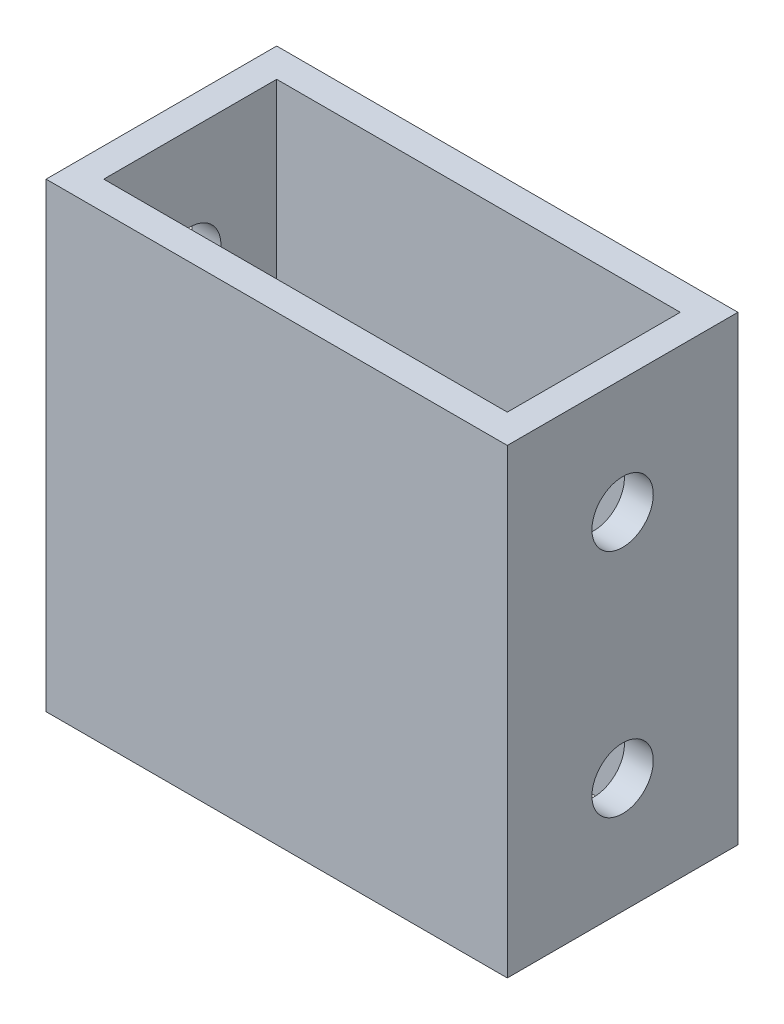
ISO-10303-21;
HEADER;
FILE_DESCRIPTION(('STEP AP214'),'2;1');
FILE_NAME('part.step','',(''),(''),'','','');
FILE_SCHEMA(('AUTOMOTIVE_DESIGN { 1 0 10303 214 1 1 1 1 }'));
ENDSEC;
DATA;
#1=APPLICATION_CONTEXT('core data for automotive mechanical design processes');
#2=APPLICATION_PROTOCOL_DEFINITION('international standard','automotive_design',2000,#1);
#3=PRODUCT_CONTEXT('',#1,'mechanical');
#4=PRODUCT('Part','Part','',(#3));
#5=PRODUCT_RELATED_PRODUCT_CATEGORY('part','',(#4));
#6=PRODUCT_DEFINITION_FORMATION('','',#4);
#7=PRODUCT_DEFINITION_CONTEXT('part definition',#1,'design');
#8=PRODUCT_DEFINITION('design','',#6,#7);
#9=PRODUCT_DEFINITION_SHAPE('','',#8);
#10=(LENGTH_UNIT() NAMED_UNIT(*) SI_UNIT(.MILLI.,.METRE.));
#11=(NAMED_UNIT(*) PLANE_ANGLE_UNIT() SI_UNIT($,.RADIAN.));
#12=(NAMED_UNIT(*) SI_UNIT($,.STERADIAN.) SOLID_ANGLE_UNIT());
#13=UNCERTAINTY_MEASURE_WITH_UNIT(LENGTH_MEASURE(1.E-05),#10,'distance_accuracy_value','');
#14=(GEOMETRIC_REPRESENTATION_CONTEXT(3) GLOBAL_UNCERTAINTY_ASSIGNED_CONTEXT((#13)) GLOBAL_UNIT_ASSIGNED_CONTEXT((#10,
#11,#12)) REPRESENTATION_CONTEXT('',''));
#15=CARTESIAN_POINT('',(0.,0.,0.));
#16=DIRECTION('',(0.,0.,1.));
#17=DIRECTION('',(1.,0.,0.));
#18=AXIS2_PLACEMENT_3D('',#15,#16,#17);
#19=CARTESIAN_POINT('',(-115.170418990036,12.7000000000002,-7.51361465816793));
#20=DIRECTION('',(1.,0.,0.));
#21=DIRECTION('',(0.,1.,0.));
#22=AXIS2_PLACEMENT_3D('',#19,#20,#21);
#23=CYLINDRICAL_SURFACE('',#22,3.3782);
#24=CARTESIAN_POINT('',(-42.1454189900364,12.7000000000002,-7.51361465816793));
#25=DIRECTION('',(1.,0.,0.));
#26=DIRECTION('',(0.,1.,0.));
#27=AXIS2_PLACEMENT_3D('',#24,#25,#26);
#28=CIRCLE('',#27,3.3782);
#29=CARTESIAN_POINT('',(-42.1454189900364,16.0782000000002,-7.51361465816793));
#30=VERTEX_POINT('',#29);
#31=EDGE_CURVE('E159',#30,#30,#28,.T.);
#32=ORIENTED_EDGE('',*,*,#31,.F.);
#33=EDGE_LOOP('',(#32));
#34=FACE_BOUND('',#33,.T.);
#35=CARTESIAN_POINT('',(-38.9704189900364,12.7000000000002,-7.51361465816793));
#36=DIRECTION('',(-1.,0.,0.));
#37=DIRECTION('',(0.,0.,1.));
#38=AXIS2_PLACEMENT_3D('',#35,#36,#37);
#39=CIRCLE('',#38,3.3782);
#40=CARTESIAN_POINT('',(-38.9704189900364,12.7000000000002,-4.13541465816793));
#41=VERTEX_POINT('',#40);
#42=EDGE_CURVE('E11',#41,#41,#39,.T.);
#43=ORIENTED_EDGE('',*,*,#42,.F.);
#44=EDGE_LOOP('',(#43));
#45=FACE_BOUND('',#44,.T.);
#46=ADVANCED_FACE('F16',(#34,#45),#23,.F.);
#47=CARTESIAN_POINT('',(-115.170418990036,38.1000000000002,-7.51361465816793));
#48=DIRECTION('',(1.,0.,0.));
#49=DIRECTION('',(0.,1.,0.));
#50=AXIS2_PLACEMENT_3D('',#47,#48,#49);
#51=CYLINDRICAL_SURFACE('',#50,3.3782);
#52=CARTESIAN_POINT('',(-42.1454189900364,38.1000000000002,-7.51361465816793));
#53=DIRECTION('',(1.,0.,0.));
#54=DIRECTION('',(0.,1.,0.));
#55=AXIS2_PLACEMENT_3D('',#52,#53,#54);
#56=CIRCLE('',#55,3.3782);
#57=CARTESIAN_POINT('',(-42.1454189900364,41.4782000000002,-7.51361465816793));
#58=VERTEX_POINT('',#57);
#59=EDGE_CURVE('E123',#58,#58,#56,.T.);
#60=ORIENTED_EDGE('',*,*,#59,.F.);
#61=EDGE_LOOP('',(#60));
#62=FACE_BOUND('',#61,.T.);
#63=CARTESIAN_POINT('',(-38.9704189900364,38.1000000000002,-7.51361465816793));
#64=DIRECTION('',(-1.,0.,0.));
#65=DIRECTION('',(0.,0.,1.));
#66=AXIS2_PLACEMENT_3D('',#63,#64,#65);
#67=CIRCLE('',#66,3.3782);
#68=CARTESIAN_POINT('',(-38.9704189900364,38.1000000000002,-4.13541465816793));
#69=VERTEX_POINT('',#68);
#70=EDGE_CURVE('E26',#69,#69,#67,.T.);
#71=ORIENTED_EDGE('',*,*,#70,.F.);
#72=EDGE_LOOP('',(#71));
#73=FACE_BOUND('',#72,.T.);
#74=ADVANCED_FACE('F198',(#62,#73),#51,.F.);
#75=CARTESIAN_POINT('',(-67.5454189900364,12.7000000000001,-7.51361465816796));
#76=DIRECTION('',(1.,0.,0.));
#77=DIRECTION('',(0.,1.,0.));
#78=AXIS2_PLACEMENT_3D('',#75,#76,#77);
#79=CYLINDRICAL_SURFACE('',#78,3.3782);
#80=CARTESIAN_POINT('',(5.4795810099636,12.7000000000001,-7.51361465816796));
#81=DIRECTION('',(1.,0.,0.));
#82=DIRECTION('',(0.,1.,0.));
#83=AXIS2_PLACEMENT_3D('',#80,#81,#82);
#84=CIRCLE('',#83,3.3782);
#85=CARTESIAN_POINT('',(5.4795810099636,16.0782000000001,-7.51361465816796));
#86=VERTEX_POINT('',#85);
#87=EDGE_CURVE('E148',#86,#86,#84,.T.);
#88=ORIENTED_EDGE('',*,*,#87,.F.);
#89=EDGE_LOOP('',(#88));
#90=FACE_BOUND('',#89,.T.);
#91=CARTESIAN_POINT('',(8.65458100996359,12.7000000000001,-7.51361465816796));
#92=DIRECTION('',(-1.,0.,0.));
#93=DIRECTION('',(0.,0.,1.));
#94=AXIS2_PLACEMENT_3D('',#91,#92,#93);
#95=CIRCLE('',#94,3.3782);
#96=CARTESIAN_POINT('',(8.65458100996359,12.7000000000001,-4.13541465816796));
#97=VERTEX_POINT('',#96);
#98=EDGE_CURVE('E128',#97,#97,#95,.T.);
#99=ORIENTED_EDGE('',*,*,#98,.F.);
#100=EDGE_LOOP('',(#99));
#101=FACE_BOUND('',#100,.T.);
#102=ADVANCED_FACE('F204',(#90,#101),#79,.F.);
#103=CARTESIAN_POINT('',(-67.5454189900364,38.1,-7.51361465816796));
#104=DIRECTION('',(1.,0.,0.));
#105=DIRECTION('',(0.,1.,0.));
#106=AXIS2_PLACEMENT_3D('',#103,#104,#105);
#107=CYLINDRICAL_SURFACE('',#106,3.3782);
#108=CARTESIAN_POINT('',(5.4795810099636,38.1,-7.51361465816796));
#109=DIRECTION('',(1.,0.,0.));
#110=DIRECTION('',(0.,1.,0.));
#111=AXIS2_PLACEMENT_3D('',#108,#109,#110);
#112=CIRCLE('',#111,3.3782);
#113=CARTESIAN_POINT('',(5.4795810099636,41.4782,-7.51361465816796));
#114=VERTEX_POINT('',#113);
#115=EDGE_CURVE('E152',#114,#114,#112,.T.);
#116=ORIENTED_EDGE('',*,*,#115,.F.);
#117=EDGE_LOOP('',(#116));
#118=FACE_BOUND('',#117,.T.);
#119=CARTESIAN_POINT('',(8.65458100996359,38.1,-7.51361465816796));
#120=DIRECTION('',(-1.,0.,0.));
#121=DIRECTION('',(0.,0.,1.));
#122=AXIS2_PLACEMENT_3D('',#119,#120,#121);
#123=CIRCLE('',#122,3.3782);
#124=CARTESIAN_POINT('',(8.65458100996359,38.1,-4.13541465816796));
#125=VERTEX_POINT('',#124);
#126=EDGE_CURVE('E132',#125,#125,#123,.T.);
#127=ORIENTED_EDGE('',*,*,#126,.F.);
#128=EDGE_LOOP('',(#127));
#129=FACE_BOUND('',#128,.T.);
#130=ADVANCED_FACE('F211',(#118,#129),#107,.F.);
#131=CARTESIAN_POINT('',(-38.9704189900364,0.,-17.038614658168));
#132=DIRECTION('',(-1.,0.,0.));
#133=DIRECTION('',(0.,0.,1.));
#134=AXIS2_PLACEMENT_3D('',#131,#132,#133);
#135=PLANE('',#134);
#136=ORIENTED_EDGE('',*,*,#42,.T.);
#137=EDGE_LOOP('',(#136));
#138=FACE_BOUND('',#137,.T.);
#139=ORIENTED_EDGE('',*,*,#70,.T.);
#140=EDGE_LOOP('',(#139));
#141=FACE_BOUND('',#140,.T.);
#142=DIRECTION('',(0.,0.,1.));
#143=VECTOR('',#142,1.);
#144=CARTESIAN_POINT('',(-38.9704189900364,0.,-12.276114658168));
#145=LINE('',#144,#143);
#146=CARTESIAN_POINT('',(-38.9704189900364,0.,-17.038614658168));
#147=VERTEX_POINT('',#146);
#148=CARTESIAN_POINT('',(-38.9704189900364,0.,2.01138534183206));
#149=VERTEX_POINT('',#148);
#150=EDGE_CURVE('E35',#147,#149,#145,.T.);
#151=ORIENTED_EDGE('',*,*,#150,.F.);
#152=DIRECTION('',(0.,1.,0.));
#153=VECTOR('',#152,1.);
#154=CARTESIAN_POINT('',(-38.9704189900364,0.,-17.038614658168));
#155=LINE('',#154,#153);
#156=CARTESIAN_POINT('',(-38.9704189900364,50.8,-17.038614658168));
#157=VERTEX_POINT('',#156);
#158=EDGE_CURVE('E147',#147,#157,#155,.T.);
#159=ORIENTED_EDGE('',*,*,#158,.T.);
#160=DIRECTION('',(0.,0.,-1.));
#161=VECTOR('',#160,1.);
#162=CARTESIAN_POINT('',(-38.9704189900364,50.8,-12.276114658168));
#163=LINE('',#162,#161);
#164=CARTESIAN_POINT('',(-38.9704189900364,50.8,2.01138534183206));
#165=VERTEX_POINT('',#164);
#166=EDGE_CURVE('E102',#165,#157,#163,.T.);
#167=ORIENTED_EDGE('',*,*,#166,.F.);
#168=DIRECTION('',(0.,1.,0.));
#169=VECTOR('',#168,1.);
#170=CARTESIAN_POINT('',(-38.9704189900364,0.,2.01138534183206));
#171=LINE('',#170,#169);
#172=EDGE_CURVE('E142',#149,#165,#171,.T.);
#173=ORIENTED_EDGE('',*,*,#172,.F.);
#174=EDGE_LOOP('',(#151,#159,#167,#173));
#175=FACE_BOUND('',#174,.T.);
#176=ADVANCED_FACE('F179',(#138,#141,#175),#135,.F.);
#177=CARTESIAN_POINT('',(5.47958100996359,0.,-17.038614658168));
#178=DIRECTION('',(0.,0.,-1.));
#179=DIRECTION('',(-1.,0.,0.));
#180=AXIS2_PLACEMENT_3D('',#177,#178,#179);
#181=PLANE('',#180);
#182=DIRECTION('',(-1.,0.,0.));
#183=VECTOR('',#182,1.);
#184=CARTESIAN_POINT('',(-5.63291899003641,0.,-17.038614658168));
#185=LINE('',#184,#183);
#186=CARTESIAN_POINT('',(5.47958100996359,0.,-17.038614658168));
#187=VERTEX_POINT('',#186);
#188=EDGE_CURVE('E133',#187,#147,#185,.T.);
#189=ORIENTED_EDGE('',*,*,#188,.F.);
#190=DIRECTION('',(0.,1.,0.));
#191=VECTOR('',#190,1.);
#192=CARTESIAN_POINT('',(5.47958100996359,0.,-17.038614658168));
#193=LINE('',#192,#191);
#194=CARTESIAN_POINT('',(5.47958100996359,50.8,-17.038614658168));
#195=VERTEX_POINT('',#194);
#196=EDGE_CURVE('E144',#187,#195,#193,.T.);
#197=ORIENTED_EDGE('',*,*,#196,.T.);
#198=DIRECTION('',(1.,0.,0.));
#199=VECTOR('',#198,1.);
#200=CARTESIAN_POINT('',(-5.63291899003641,50.8,-17.038614658168));
#201=LINE('',#200,#199);
#202=EDGE_CURVE('E113',#157,#195,#201,.T.);
#203=ORIENTED_EDGE('',*,*,#202,.F.);
#204=ORIENTED_EDGE('',*,*,#158,.F.);
#205=EDGE_LOOP('',(#189,#197,#203,#204));
#206=FACE_BOUND('',#205,.T.);
#207=ADVANCED_FACE('F181',(#206),#181,.F.);
#208=CARTESIAN_POINT('',(5.4795810099636,0.,2.01138534183205));
#209=DIRECTION('',(1.,0.,0.));
#210=DIRECTION('',(0.,0.,-1.));
#211=AXIS2_PLACEMENT_3D('',#208,#209,#210);
#212=PLANE('',#211);
#213=ORIENTED_EDGE('',*,*,#87,.T.);
#214=EDGE_LOOP('',(#213));
#215=FACE_BOUND('',#214,.T.);
#216=ORIENTED_EDGE('',*,*,#115,.T.);
#217=EDGE_LOOP('',(#216));
#218=FACE_BOUND('',#217,.T.);
#219=DIRECTION('',(0.,0.,-1.));
#220=VECTOR('',#219,1.);
#221=CARTESIAN_POINT('',(5.4795810099636,0.,-2.75111465816796));
#222=LINE('',#221,#220);
#223=CARTESIAN_POINT('',(5.4795810099636,0.,2.01138534183205));
#224=VERTEX_POINT('',#223);
#225=EDGE_CURVE('E135',#224,#187,#222,.T.);
#226=ORIENTED_EDGE('',*,*,#225,.F.);
#227=DIRECTION('',(0.,1.,0.));
#228=VECTOR('',#227,1.);
#229=CARTESIAN_POINT('',(5.4795810099636,0.,2.01138534183205));
#230=LINE('',#229,#228);
#231=CARTESIAN_POINT('',(5.4795810099636,50.8,2.01138534183205));
#232=VERTEX_POINT('',#231);
#233=EDGE_CURVE('E150',#224,#232,#230,.T.);
#234=ORIENTED_EDGE('',*,*,#233,.T.);
#235=DIRECTION('',(0.,0.,1.));
#236=VECTOR('',#235,1.);
#237=CARTESIAN_POINT('',(5.4795810099636,50.8,-2.75111465816796));
#238=LINE('',#237,#236);
#239=EDGE_CURVE('E109',#195,#232,#238,.T.);
#240=ORIENTED_EDGE('',*,*,#239,.F.);
#241=ORIENTED_EDGE('',*,*,#196,.F.);
#242=EDGE_LOOP('',(#226,#234,#240,#241));
#243=FACE_BOUND('',#242,.T.);
#244=ADVANCED_FACE('F183',(#215,#218,#243),#212,.F.);
#245=CARTESIAN_POINT('',(-38.9704189900364,0.,2.01138534183206));
#246=DIRECTION('',(0.,0.,1.));
#247=DIRECTION('',(1.,0.,0.));
#248=AXIS2_PLACEMENT_3D('',#245,#246,#247);
#249=PLANE('',#248);
#250=DIRECTION('',(1.,0.,0.));
#251=VECTOR('',#250,1.);
#252=CARTESIAN_POINT('',(-27.8579189900364,0.,2.01138534183206));
#253=LINE('',#252,#251);
#254=EDGE_CURVE('E117',#149,#224,#253,.T.);
#255=ORIENTED_EDGE('',*,*,#254,.F.);
#256=ORIENTED_EDGE('',*,*,#172,.T.);
#257=DIRECTION('',(-1.,0.,0.));
#258=VECTOR('',#257,1.);
#259=CARTESIAN_POINT('',(-27.8579189900364,50.8,2.01138534183206));
#260=LINE('',#259,#258);
#261=EDGE_CURVE('E107',#232,#165,#260,.T.);
#262=ORIENTED_EDGE('',*,*,#261,.F.);
#263=ORIENTED_EDGE('',*,*,#233,.F.);
#264=EDGE_LOOP('',(#255,#256,#262,#263));
#265=FACE_BOUND('',#264,.T.);
#266=ADVANCED_FACE('F185',(#265),#249,.F.);
#267=CARTESIAN_POINT('',(-42.1454189900364,0.,-20.213614658168));
#268=DIRECTION('',(-1.,0.,0.));
#269=DIRECTION('',(0.,0.,1.));
#270=AXIS2_PLACEMENT_3D('',#267,#268,#269);
#271=PLANE('',#270);
#272=ORIENTED_EDGE('',*,*,#31,.T.);
#273=EDGE_LOOP('',(#272));
#274=FACE_BOUND('',#273,.T.);
#275=ORIENTED_EDGE('',*,*,#59,.T.);
#276=EDGE_LOOP('',(#275));
#277=FACE_BOUND('',#276,.T.);
#278=DIRECTION('',(0.,0.,-1.));
#279=VECTOR('',#278,1.);
#280=CARTESIAN_POINT('',(-42.1454189900364,0.,5.18638534183204));
#281=LINE('',#280,#279);
#282=CARTESIAN_POINT('',(-42.1454189900364,0.,5.18638534183204));
#283=VERTEX_POINT('',#282);
#284=CARTESIAN_POINT('',(-42.1454189900364,0.,-20.213614658168));
#285=VERTEX_POINT('',#284);
#286=EDGE_CURVE('E118',#283,#285,#281,.T.);
#287=ORIENTED_EDGE('',*,*,#286,.F.);
#288=DIRECTION('',(0.,1.,0.));
#289=VECTOR('',#288,1.);
#290=CARTESIAN_POINT('',(-42.1454189900364,0.,5.18638534183204));
#291=LINE('',#290,#289);
#292=CARTESIAN_POINT('',(-42.1454189900364,50.8,5.18638534183204));
#293=VERTEX_POINT('',#292);
#294=EDGE_CURVE('E121',#283,#293,#291,.T.);
#295=ORIENTED_EDGE('',*,*,#294,.T.);
#296=DIRECTION('',(0.,0.,1.));
#297=VECTOR('',#296,1.);
#298=CARTESIAN_POINT('',(-42.1454189900364,50.8,5.18638534183204));
#299=LINE('',#298,#297);
#300=CARTESIAN_POINT('',(-42.1454189900364,50.8,-20.213614658168));
#301=VERTEX_POINT('',#300);
#302=EDGE_CURVE('E105',#301,#293,#299,.T.);
#303=ORIENTED_EDGE('',*,*,#302,.F.);
#304=DIRECTION('',(0.,1.,0.));
#305=VECTOR('',#304,1.);
#306=CARTESIAN_POINT('',(-42.1454189900364,0.,-20.213614658168));
#307=LINE('',#306,#305);
#308=EDGE_CURVE('E124',#285,#301,#307,.T.);
#309=ORIENTED_EDGE('',*,*,#308,.F.);
#310=EDGE_LOOP('',(#287,#295,#303,#309));
#311=FACE_BOUND('',#310,.T.);
#312=ADVANCED_FACE('F193',(#274,#277,#311),#271,.T.);
#313=CARTESIAN_POINT('',(8.65458100996359,0.,-20.213614658168));
#314=DIRECTION('',(0.,0.,-1.));
#315=DIRECTION('',(-1.,0.,0.));
#316=AXIS2_PLACEMENT_3D('',#313,#314,#315);
#317=PLANE('',#316);
#318=DIRECTION('',(1.,0.,0.));
#319=VECTOR('',#318,1.);
#320=CARTESIAN_POINT('',(-42.1454189900364,0.,-20.213614658168));
#321=LINE('',#320,#319);
#322=CARTESIAN_POINT('',(8.65458100996359,0.,-20.213614658168));
#323=VERTEX_POINT('',#322);
#324=EDGE_CURVE('E120',#285,#323,#321,.T.);
#325=ORIENTED_EDGE('',*,*,#324,.F.);
#326=ORIENTED_EDGE('',*,*,#308,.T.);
#327=DIRECTION('',(-1.,0.,0.));
#328=VECTOR('',#327,1.);
#329=CARTESIAN_POINT('',(-42.1454189900364,50.8,-20.213614658168));
#330=LINE('',#329,#328);
#331=CARTESIAN_POINT('',(8.65458100996359,50.8,-20.213614658168));
#332=VERTEX_POINT('',#331);
#333=EDGE_CURVE('E95',#332,#301,#330,.T.);
#334=ORIENTED_EDGE('',*,*,#333,.F.);
#335=DIRECTION('',(0.,1.,0.));
#336=VECTOR('',#335,1.);
#337=CARTESIAN_POINT('',(8.65458100996359,0.,-20.213614658168));
#338=LINE('',#337,#336);
#339=EDGE_CURVE('E91',#323,#332,#338,.T.);
#340=ORIENTED_EDGE('',*,*,#339,.F.);
#341=EDGE_LOOP('',(#325,#326,#334,#340));
#342=FACE_BOUND('',#341,.T.);
#343=ADVANCED_FACE('F248',(#342),#317,.T.);
#344=CARTESIAN_POINT('',(8.65458100996359,0.,5.18638534183204));
#345=DIRECTION('',(1.,0.,0.));
#346=DIRECTION('',(0.,0.,-1.));
#347=AXIS2_PLACEMENT_3D('',#344,#345,#346);
#348=PLANE('',#347);
#349=ORIENTED_EDGE('',*,*,#98,.T.);
#350=EDGE_LOOP('',(#349));
#351=FACE_BOUND('',#350,.T.);
#352=ORIENTED_EDGE('',*,*,#126,.T.);
#353=EDGE_LOOP('',(#352));
#354=FACE_BOUND('',#353,.T.);
#355=DIRECTION('',(0.,0.,1.));
#356=VECTOR('',#355,1.);
#357=CARTESIAN_POINT('',(8.65458100996359,0.,-20.213614658168));
#358=LINE('',#357,#356);
#359=CARTESIAN_POINT('',(8.65458100996359,0.,5.18638534183204));
#360=VERTEX_POINT('',#359);
#361=EDGE_CURVE('E79',#323,#360,#358,.T.);
#362=ORIENTED_EDGE('',*,*,#361,.F.);
#363=ORIENTED_EDGE('',*,*,#339,.T.);
#364=DIRECTION('',(0.,0.,-1.));
#365=VECTOR('',#364,1.);
#366=CARTESIAN_POINT('',(8.65458100996359,50.8,-20.213614658168));
#367=LINE('',#366,#365);
#368=CARTESIAN_POINT('',(8.65458100996359,50.8,5.18638534183204));
#369=VERTEX_POINT('',#368);
#370=EDGE_CURVE('E85',#369,#332,#367,.T.);
#371=ORIENTED_EDGE('',*,*,#370,.F.);
#372=DIRECTION('',(0.,1.,0.));
#373=VECTOR('',#372,1.);
#374=CARTESIAN_POINT('',(8.65458100996359,0.,5.18638534183204));
#375=LINE('',#374,#373);
#376=EDGE_CURVE('E88',#360,#369,#375,.T.);
#377=ORIENTED_EDGE('',*,*,#376,.F.);
#378=EDGE_LOOP('',(#362,#363,#371,#377));
#379=FACE_BOUND('',#378,.T.);
#380=ADVANCED_FACE('F87',(#351,#354,#379),#348,.T.);
#381=CARTESIAN_POINT('',(-42.1454189900364,0.,5.18638534183204));
#382=DIRECTION('',(0.,0.,1.));
#383=DIRECTION('',(1.,0.,0.));
#384=AXIS2_PLACEMENT_3D('',#381,#382,#383);
#385=PLANE('',#384);
#386=DIRECTION('',(-1.,0.,0.));
#387=VECTOR('',#386,1.);
#388=CARTESIAN_POINT('',(8.65458100996359,0.,5.18638534183204));
#389=LINE('',#388,#387);
#390=EDGE_CURVE('E101',#360,#283,#389,.T.);
#391=ORIENTED_EDGE('',*,*,#390,.F.);
#392=ORIENTED_EDGE('',*,*,#376,.T.);
#393=DIRECTION('',(1.,0.,0.));
#394=VECTOR('',#393,1.);
#395=CARTESIAN_POINT('',(8.65458100996359,50.8,5.18638534183204));
#396=LINE('',#395,#394);
#397=EDGE_CURVE('E20',#293,#369,#396,.T.);
#398=ORIENTED_EDGE('',*,*,#397,.F.);
#399=ORIENTED_EDGE('',*,*,#294,.F.);
#400=EDGE_LOOP('',(#391,#392,#398,#399));
#401=FACE_BOUND('',#400,.T.);
#402=ADVANCED_FACE('F99',(#401),#385,.T.);
#403=CARTESIAN_POINT('',(-16.7454189900364,50.8,-7.51361465816796));
#404=DIRECTION('',(0.,1.,0.));
#405=DIRECTION('',(0.,0.,1.));
#406=AXIS2_PLACEMENT_3D('',#403,#404,#405);
#407=PLANE('',#406);
#408=ORIENTED_EDGE('',*,*,#166,.T.);
#409=ORIENTED_EDGE('',*,*,#202,.T.);
#410=ORIENTED_EDGE('',*,*,#239,.T.);
#411=ORIENTED_EDGE('',*,*,#261,.T.);
#412=EDGE_LOOP('',(#408,#409,#410,#411));
#413=FACE_BOUND('',#412,.T.);
#414=ORIENTED_EDGE('',*,*,#397,.T.);
#415=ORIENTED_EDGE('',*,*,#370,.T.);
#416=ORIENTED_EDGE('',*,*,#333,.T.);
#417=ORIENTED_EDGE('',*,*,#302,.T.);
#418=EDGE_LOOP('',(#414,#415,#416,#417));
#419=FACE_BOUND('',#418,.T.);
#420=ADVANCED_FACE('F104',(#413,#419),#407,.T.);
#421=CARTESIAN_POINT('',(-16.7454189900364,0.,-7.51361465816796));
#422=DIRECTION('',(0.,1.,0.));
#423=DIRECTION('',(0.,0.,1.));
#424=AXIS2_PLACEMENT_3D('',#421,#422,#423);
#425=PLANE('',#424);
#426=ORIENTED_EDGE('',*,*,#150,.T.);
#427=ORIENTED_EDGE('',*,*,#254,.T.);
#428=ORIENTED_EDGE('',*,*,#225,.T.);
#429=ORIENTED_EDGE('',*,*,#188,.T.);
#430=EDGE_LOOP('',(#426,#427,#428,#429));
#431=FACE_BOUND('',#430,.T.);
#432=ORIENTED_EDGE('',*,*,#390,.T.);
#433=ORIENTED_EDGE('',*,*,#286,.T.);
#434=ORIENTED_EDGE('',*,*,#324,.T.);
#435=ORIENTED_EDGE('',*,*,#361,.T.);
#436=EDGE_LOOP('',(#432,#433,#434,#435));
#437=FACE_BOUND('',#436,.T.);
#438=ADVANCED_FACE('F18',(#431,#437),#425,.F.);
#439=CLOSED_SHELL('',(#46,#74,#102,#130,#176,#207,#244,#266,#312,#343,#380,#402,#420,#438));
#440=MANIFOLD_SOLID_BREP('B1',#439);
#441=ADVANCED_BREP_SHAPE_REPRESENTATION('',(#18,#440),#14);
#442=SHAPE_DEFINITION_REPRESENTATION(#9,#441);
ENDSEC;
END-ISO-10303-21;
